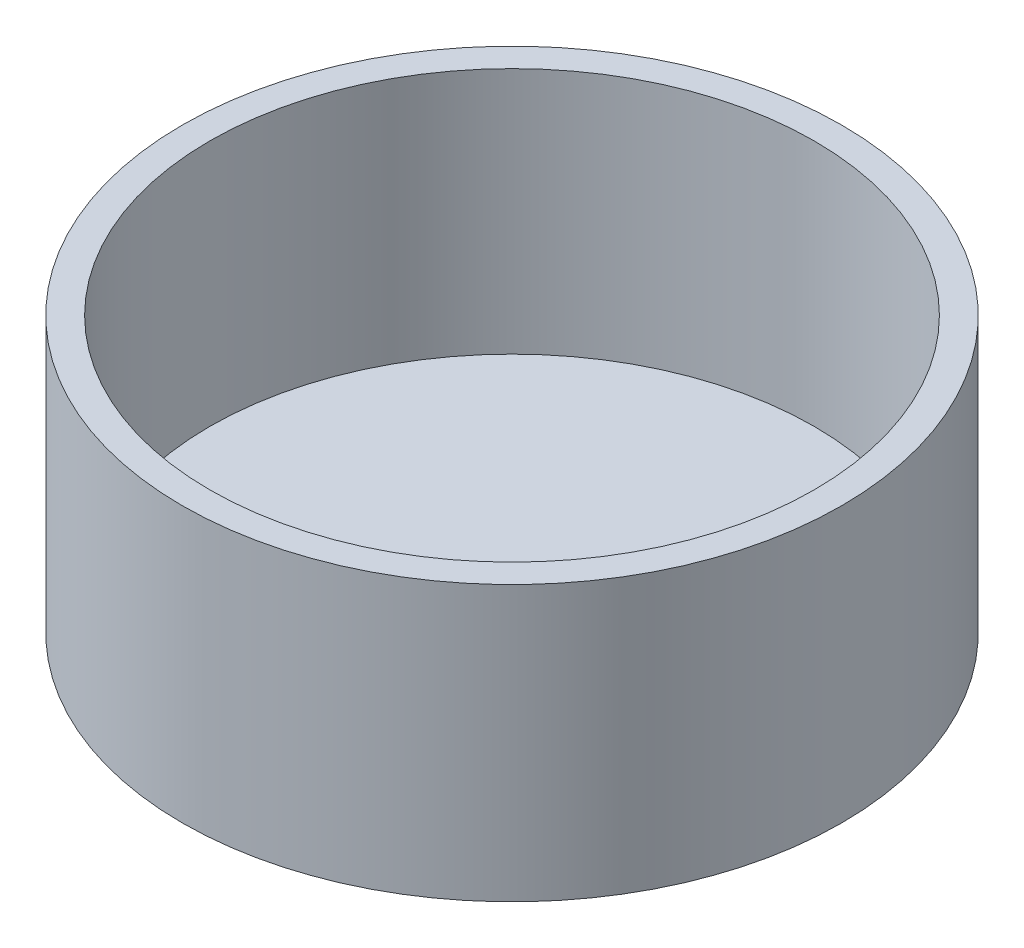
ISO-10303-21;
HEADER;
FILE_DESCRIPTION(('STEP AP214'),'2;1');
FILE_NAME('part.step','',(''),(''),'','','');
FILE_SCHEMA(('AUTOMOTIVE_DESIGN { 1 0 10303 214 1 1 1 1 }'));
ENDSEC;
DATA;
#1=APPLICATION_CONTEXT('core data for automotive mechanical design processes');
#2=APPLICATION_PROTOCOL_DEFINITION('international standard','automotive_design',2000,#1);
#3=PRODUCT_CONTEXT('',#1,'mechanical');
#4=PRODUCT('Part','Part','',(#3));
#5=PRODUCT_RELATED_PRODUCT_CATEGORY('part','',(#4));
#6=PRODUCT_DEFINITION_FORMATION('','',#4);
#7=PRODUCT_DEFINITION_CONTEXT('part definition',#1,'design');
#8=PRODUCT_DEFINITION('design','',#6,#7);
#9=PRODUCT_DEFINITION_SHAPE('','',#8);
#10=(LENGTH_UNIT() NAMED_UNIT(*) SI_UNIT(.MILLI.,.METRE.));
#11=(NAMED_UNIT(*) PLANE_ANGLE_UNIT() SI_UNIT($,.RADIAN.));
#12=(NAMED_UNIT(*) SI_UNIT($,.STERADIAN.) SOLID_ANGLE_UNIT());
#13=UNCERTAINTY_MEASURE_WITH_UNIT(LENGTH_MEASURE(1.E-05),#10,'distance_accuracy_value','');
#14=(GEOMETRIC_REPRESENTATION_CONTEXT(3) GLOBAL_UNCERTAINTY_ASSIGNED_CONTEXT((#13)) GLOBAL_UNIT_ASSIGNED_CONTEXT((#10,
#11,#12)) REPRESENTATION_CONTEXT('',''));
#15=CARTESIAN_POINT('',(0.,0.,0.));
#16=DIRECTION('',(0.,0.,1.));
#17=DIRECTION('',(1.,0.,0.));
#18=AXIS2_PLACEMENT_3D('',#15,#16,#17);
#19=CARTESIAN_POINT('',(0.,127.,0.));
#20=DIRECTION('',(0.,-1.,0.));
#21=DIRECTION('',(0.,0.,-1.));
#22=AXIS2_PLACEMENT_3D('',#19,#20,#21);
#23=CYLINDRICAL_SURFACE('',#22,139.7);
#24=CARTESIAN_POINT('',(0.,12.7,0.));
#25=DIRECTION('',(0.,1.,0.));
#26=DIRECTION('',(0.,0.,1.));
#27=AXIS2_PLACEMENT_3D('',#24,#25,#26);
#28=CIRCLE('',#27,139.7);
#29=CARTESIAN_POINT('',(0.,12.7,139.7));
#30=VERTEX_POINT('',#29);
#31=EDGE_CURVE('E10',#30,#30,#28,.T.);
#32=ORIENTED_EDGE('',*,*,#31,.F.);
#33=EDGE_LOOP('',(#32));
#34=FACE_BOUND('',#33,.T.);
#35=CARTESIAN_POINT('',(0.,127.,0.));
#36=DIRECTION('',(0.,1.,0.));
#37=DIRECTION('',(0.,0.,1.));
#38=AXIS2_PLACEMENT_3D('',#35,#36,#37);
#39=CIRCLE('',#38,139.7);
#40=CARTESIAN_POINT('',(0.,127.,139.7));
#41=VERTEX_POINT('',#40);
#42=EDGE_CURVE('E55',#41,#41,#39,.T.);
#43=ORIENTED_EDGE('',*,*,#42,.T.);
#44=EDGE_LOOP('',(#43));
#45=FACE_BOUND('',#44,.T.);
#46=ADVANCED_FACE('F43',(#34,#45),#23,.F.);
#47=CARTESIAN_POINT('',(0.,127.,0.));
#48=DIRECTION('',(0.,-1.,0.));
#49=DIRECTION('',(0.,0.,-1.));
#50=AXIS2_PLACEMENT_3D('',#47,#48,#49);
#51=CYLINDRICAL_SURFACE('',#50,152.4);
#52=CARTESIAN_POINT('',(0.,127.,0.));
#53=DIRECTION('',(0.,1.,0.));
#54=DIRECTION('',(0.,0.,1.));
#55=AXIS2_PLACEMENT_3D('',#52,#53,#54);
#56=CIRCLE('',#55,152.4);
#57=CARTESIAN_POINT('',(0.,127.,152.4));
#58=VERTEX_POINT('',#57);
#59=EDGE_CURVE('E50',#58,#58,#56,.T.);
#60=ORIENTED_EDGE('',*,*,#59,.F.);
#61=EDGE_LOOP('',(#60));
#62=FACE_BOUND('',#61,.T.);
#63=CARTESIAN_POINT('',(0.,0.,0.));
#64=DIRECTION('',(0.,1.,0.));
#65=DIRECTION('',(0.,0.,1.));
#66=AXIS2_PLACEMENT_3D('',#63,#64,#65);
#67=CIRCLE('',#66,152.4);
#68=CARTESIAN_POINT('',(0.,0.,152.4));
#69=VERTEX_POINT('',#68);
#70=EDGE_CURVE('E61',#69,#69,#67,.T.);
#71=ORIENTED_EDGE('',*,*,#70,.T.);
#72=EDGE_LOOP('',(#71));
#73=FACE_BOUND('',#72,.T.);
#74=ADVANCED_FACE('F67',(#62,#73),#51,.T.);
#75=CARTESIAN_POINT('',(0.,127.,0.));
#76=DIRECTION('',(0.,1.,0.));
#77=DIRECTION('',(0.,0.,1.));
#78=AXIS2_PLACEMENT_3D('',#75,#76,#77);
#79=PLANE('',#78);
#80=ORIENTED_EDGE('',*,*,#42,.F.);
#81=EDGE_LOOP('',(#80));
#82=FACE_BOUND('',#81,.T.);
#83=ORIENTED_EDGE('',*,*,#59,.T.);
#84=EDGE_LOOP('',(#83));
#85=FACE_BOUND('',#84,.T.);
#86=ADVANCED_FACE('F72',(#82,#85),#79,.T.);
#87=CARTESIAN_POINT('',(0.,0.,0.));
#88=DIRECTION('',(0.,1.,0.));
#89=DIRECTION('',(0.,0.,1.));
#90=AXIS2_PLACEMENT_3D('',#87,#88,#89);
#91=PLANE('',#90);
#92=ORIENTED_EDGE('',*,*,#70,.F.);
#93=EDGE_LOOP('',(#92));
#94=FACE_BOUND('',#93,.T.);
#95=ADVANCED_FACE('F69',(#94),#91,.F.);
#96=CARTESIAN_POINT('',(0.,12.7,0.));
#97=DIRECTION('',(0.,1.,0.));
#98=DIRECTION('',(0.,0.,1.));
#99=AXIS2_PLACEMENT_3D('',#96,#97,#98);
#100=PLANE('',#99);
#101=ORIENTED_EDGE('',*,*,#31,.T.);
#102=EDGE_LOOP('',(#101));
#103=FACE_BOUND('',#102,.T.);
#104=ADVANCED_FACE('F71',(#103),#100,.T.);
#105=CLOSED_SHELL('',(#46,#74,#86,#95,#104));
#106=MANIFOLD_SOLID_BREP('B2',#105);
#107=ADVANCED_BREP_SHAPE_REPRESENTATION('',(#18,#106),#14);
#108=SHAPE_DEFINITION_REPRESENTATION(#9,#107);
ENDSEC;
END-ISO-10303-21;
